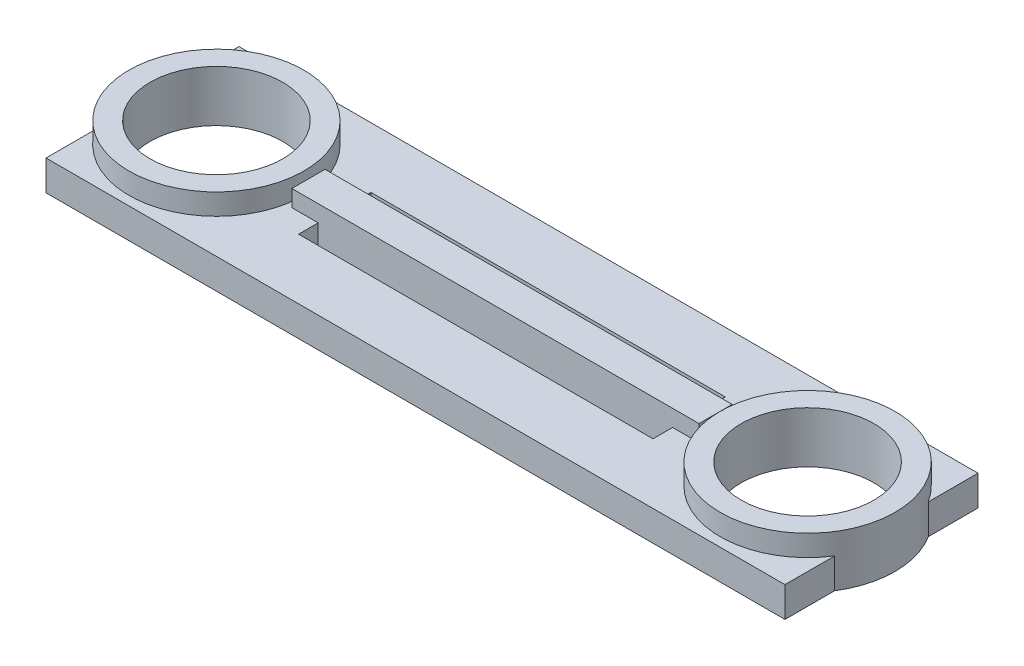
ISO-10303-21;
HEADER;
FILE_DESCRIPTION(('STEP AP214'),'2;1');
FILE_NAME('part.step','',(''),(''),'','','');
FILE_SCHEMA(('AUTOMOTIVE_DESIGN { 1 0 10303 214 1 1 1 1 }'));
ENDSEC;
DATA;
#1=APPLICATION_CONTEXT('core data for automotive mechanical design processes');
#2=APPLICATION_PROTOCOL_DEFINITION('international standard','automotive_design',2000,#1);
#3=PRODUCT_CONTEXT('',#1,'mechanical');
#4=PRODUCT('Part','Part','',(#3));
#5=PRODUCT_RELATED_PRODUCT_CATEGORY('part','',(#4));
#6=PRODUCT_DEFINITION_FORMATION('','',#4);
#7=PRODUCT_DEFINITION_CONTEXT('part definition',#1,'design');
#8=PRODUCT_DEFINITION('design','',#6,#7);
#9=PRODUCT_DEFINITION_SHAPE('','',#8);
#10=(LENGTH_UNIT() NAMED_UNIT(*) SI_UNIT(.MILLI.,.METRE.));
#11=(NAMED_UNIT(*) PLANE_ANGLE_UNIT() SI_UNIT($,.RADIAN.));
#12=(NAMED_UNIT(*) SI_UNIT($,.STERADIAN.) SOLID_ANGLE_UNIT());
#13=UNCERTAINTY_MEASURE_WITH_UNIT(LENGTH_MEASURE(1.E-05),#10,'distance_accuracy_value','');
#14=(GEOMETRIC_REPRESENTATION_CONTEXT(3) GLOBAL_UNCERTAINTY_ASSIGNED_CONTEXT((#13)) GLOBAL_UNIT_ASSIGNED_CONTEXT((#10,
#11,#12)) REPRESENTATION_CONTEXT('',''));
#15=CARTESIAN_POINT('',(0.,0.,0.));
#16=DIRECTION('',(0.,0.,1.));
#17=DIRECTION('',(1.,0.,0.));
#18=AXIS2_PLACEMENT_3D('',#15,#16,#17);
#19=CARTESIAN_POINT('',(0.,20.,0.));
#20=DIRECTION('',(0.,-1.,0.));
#21=DIRECTION('',(0.,0.,-1.));
#22=AXIS2_PLACEMENT_3D('',#19,#20,#21);
#23=PLANE('',#22);
#24=CARTESIAN_POINT('',(196.,20.,0.));
#25=DIRECTION('',(0.,-1.,0.));
#26=DIRECTION('',(0.,0.,-1.));
#27=AXIS2_PLACEMENT_3D('',#24,#25,#26);
#28=CIRCLE('',#27,58.);
#29=CARTESIAN_POINT('',(245.,20.,-31.0322412983658));
#30=VERTEX_POINT('',#29);
#31=CARTESIAN_POINT('',(245.,20.,31.0322412983658));
#32=VERTEX_POINT('',#31);
#33=EDGE_CURVE('E229',#30,#32,#28,.F.);
#34=ORIENTED_EDGE('',*,*,#33,.F.);
#35=DIRECTION('',(0.,0.,-1.));
#36=VECTOR('',#35,1.);
#37=CARTESIAN_POINT('',(245.,20.,64.));
#38=LINE('',#37,#36);
#39=CARTESIAN_POINT('',(245.,20.,-64.));
#40=VERTEX_POINT('',#39);
#41=EDGE_CURVE('E290',#30,#40,#38,.T.);
#42=ORIENTED_EDGE('',*,*,#41,.T.);
#43=DIRECTION('',(-1.,0.,0.));
#44=VECTOR('',#43,1.);
#45=CARTESIAN_POINT('',(-245.,20.,-64.));
#46=LINE('',#45,#44);
#47=CARTESIAN_POINT('',(-245.,20.,-64.));
#48=VERTEX_POINT('',#47);
#49=EDGE_CURVE('E289',#40,#48,#46,.T.);
#50=ORIENTED_EDGE('',*,*,#49,.T.);
#51=DIRECTION('',(0.,0.,1.));
#52=VECTOR('',#51,1.);
#53=CARTESIAN_POINT('',(-245.,20.,64.));
#54=LINE('',#53,#52);
#55=CARTESIAN_POINT('',(-245.,20.,-31.0322412983658));
#56=VERTEX_POINT('',#55);
#57=EDGE_CURVE('E293',#48,#56,#54,.T.);
#58=ORIENTED_EDGE('',*,*,#57,.T.);
#59=CARTESIAN_POINT('',(-196.,20.,0.));
#60=DIRECTION('',(0.,-1.,0.));
#61=DIRECTION('',(0.,0.,-1.));
#62=AXIS2_PLACEMENT_3D('',#59,#60,#61);
#63=CIRCLE('',#62,58.);
#64=CARTESIAN_POINT('',(-245.,20.,31.0322412983658));
#65=VERTEX_POINT('',#64);
#66=EDGE_CURVE('E239',#65,#56,#63,.F.);
#67=ORIENTED_EDGE('',*,*,#66,.F.);
#68=CARTESIAN_POINT('',(-245.,20.,64.));
#69=VERTEX_POINT('',#68);
#70=EDGE_CURVE('E292',#65,#69,#54,.T.);
#71=ORIENTED_EDGE('',*,*,#70,.T.);
#72=DIRECTION('',(1.,0.,0.));
#73=VECTOR('',#72,1.);
#74=CARTESIAN_POINT('',(-245.,20.,64.));
#75=LINE('',#74,#73);
#76=CARTESIAN_POINT('',(245.,20.,64.));
#77=VERTEX_POINT('',#76);
#78=EDGE_CURVE('E296',#69,#77,#75,.T.);
#79=ORIENTED_EDGE('',*,*,#78,.T.);
#80=EDGE_CURVE('E286',#77,#32,#38,.T.);
#81=ORIENTED_EDGE('',*,*,#80,.T.);
#82=EDGE_LOOP('',(#34,#42,#50,#58,#67,#71,#79,#81));
#83=FACE_BOUND('',#82,.T.);
#84=DIRECTION('',(-1.,0.,0.));
#85=VECTOR('',#84,1.);
#86=CARTESIAN_POINT('',(0.,20.,-11.));
#87=LINE('',#86,#85);
#88=CARTESIAN_POINT('',(-117.5,20.,-11.));
#89=VERTEX_POINT('',#88);
#90=CARTESIAN_POINT('',(-135.,20.,-11.));
#91=VERTEX_POINT('',#90);
#92=EDGE_CURVE('E211',#89,#91,#87,.T.);
#93=ORIENTED_EDGE('',*,*,#92,.F.);
#94=DIRECTION('',(0.,0.,1.));
#95=VECTOR('',#94,1.);
#96=CARTESIAN_POINT('',(-117.5,20.,24.));
#97=LINE('',#96,#95);
#98=CARTESIAN_POINT('',(-117.5,20.,-24.));
#99=VERTEX_POINT('',#98);
#100=EDGE_CURVE('E252',#99,#89,#97,.T.);
#101=ORIENTED_EDGE('',*,*,#100,.F.);
#102=DIRECTION('',(-1.,0.,0.));
#103=VECTOR('',#102,1.);
#104=CARTESIAN_POINT('',(-117.5,20.,-24.));
#105=LINE('',#104,#103);
#106=CARTESIAN_POINT('',(117.5,20.,-24.));
#107=VERTEX_POINT('',#106);
#108=EDGE_CURVE('E248',#107,#99,#105,.T.);
#109=ORIENTED_EDGE('',*,*,#108,.F.);
#110=DIRECTION('',(0.,0.,-1.));
#111=VECTOR('',#110,1.);
#112=CARTESIAN_POINT('',(117.5,20.,24.));
#113=LINE('',#112,#111);
#114=CARTESIAN_POINT('',(117.5,20.,-11.));
#115=VERTEX_POINT('',#114);
#116=EDGE_CURVE('E249',#115,#107,#113,.T.);
#117=ORIENTED_EDGE('',*,*,#116,.F.);
#118=CARTESIAN_POINT('',(135.,20.,-11.));
#119=VERTEX_POINT('',#118);
#120=EDGE_CURVE('E214',#119,#115,#87,.T.);
#121=ORIENTED_EDGE('',*,*,#120,.F.);
#122=DIRECTION('',(0.,0.,-1.));
#123=VECTOR('',#122,1.);
#124=CARTESIAN_POINT('',(135.,20.,0.));
#125=LINE('',#124,#123);
#126=CARTESIAN_POINT('',(135.,20.,11.));
#127=VERTEX_POINT('',#126);
#128=EDGE_CURVE('E199',#127,#119,#125,.T.);
#129=ORIENTED_EDGE('',*,*,#128,.F.);
#130=DIRECTION('',(1.,0.,0.));
#131=VECTOR('',#130,1.);
#132=CARTESIAN_POINT('',(0.,20.,11.));
#133=LINE('',#132,#131);
#134=CARTESIAN_POINT('',(117.5,20.,11.));
#135=VERTEX_POINT('',#134);
#136=EDGE_CURVE('E204',#135,#127,#133,.T.);
#137=ORIENTED_EDGE('',*,*,#136,.F.);
#138=CARTESIAN_POINT('',(117.5,20.,24.));
#139=VERTEX_POINT('',#138);
#140=EDGE_CURVE('E245',#139,#135,#113,.T.);
#141=ORIENTED_EDGE('',*,*,#140,.F.);
#142=DIRECTION('',(1.,0.,0.));
#143=VECTOR('',#142,1.);
#144=CARTESIAN_POINT('',(-117.5,20.,24.));
#145=LINE('',#144,#143);
#146=CARTESIAN_POINT('',(-117.5,20.,24.));
#147=VERTEX_POINT('',#146);
#148=EDGE_CURVE('E255',#147,#139,#145,.T.);
#149=ORIENTED_EDGE('',*,*,#148,.F.);
#150=CARTESIAN_POINT('',(-117.5,20.,11.));
#151=VERTEX_POINT('',#150);
#152=EDGE_CURVE('E251',#151,#147,#97,.T.);
#153=ORIENTED_EDGE('',*,*,#152,.F.);
#154=CARTESIAN_POINT('',(-135.,20.,11.));
#155=VERTEX_POINT('',#154);
#156=EDGE_CURVE('E200',#155,#151,#133,.T.);
#157=ORIENTED_EDGE('',*,*,#156,.F.);
#158=DIRECTION('',(0.,0.,1.));
#159=VECTOR('',#158,1.);
#160=CARTESIAN_POINT('',(-135.,20.,0.));
#161=LINE('',#160,#159);
#162=EDGE_CURVE('E217',#91,#155,#161,.T.);
#163=ORIENTED_EDGE('',*,*,#162,.F.);
#164=EDGE_LOOP('',(#93,#101,#109,#117,#121,#129,#137,#141,#149,#153,#157,#163));
#165=FACE_BOUND('',#164,.T.);
#166=ADVANCED_FACE('F39',(#83,#165),#23,.F.);
#167=CARTESIAN_POINT('',(117.5,20.,24.));
#168=DIRECTION('',(-1.,0.,0.));
#169=DIRECTION('',(0.,0.,1.));
#170=AXIS2_PLACEMENT_3D('',#167,#168,#169);
#171=PLANE('',#170);
#172=DIRECTION('',(0.,0.,-1.));
#173=VECTOR('',#172,1.);
#174=CARTESIAN_POINT('',(117.5,0.,24.));
#175=LINE('',#174,#173);
#176=CARTESIAN_POINT('',(117.5,0.,-11.));
#177=VERTEX_POINT('',#176);
#178=CARTESIAN_POINT('',(117.5,0.,-24.));
#179=VERTEX_POINT('',#178);
#180=EDGE_CURVE('E244',#177,#179,#175,.T.);
#181=ORIENTED_EDGE('',*,*,#180,.F.);
#182=DIRECTION('',(0.,1.,0.));
#183=VECTOR('',#182,1.);
#184=CARTESIAN_POINT('',(117.5,20.,-11.));
#185=LINE('',#184,#183);
#186=EDGE_CURVE('E213',#177,#115,#185,.T.);
#187=ORIENTED_EDGE('',*,*,#186,.T.);
#188=ORIENTED_EDGE('',*,*,#116,.T.);
#189=DIRECTION('',(0.,-1.,0.));
#190=VECTOR('',#189,1.);
#191=CARTESIAN_POINT('',(117.5,20.,-24.));
#192=LINE('',#191,#190);
#193=EDGE_CURVE('E276',#107,#179,#192,.T.);
#194=ORIENTED_EDGE('',*,*,#193,.T.);
#195=EDGE_LOOP('',(#181,#187,#188,#194));
#196=FACE_BOUND('',#195,.T.);
#197=ADVANCED_FACE('F389',(#196),#171,.T.);
#198=ORIENTED_EDGE('',*,*,#140,.T.);
#199=DIRECTION('',(0.,-1.,0.));
#200=VECTOR('',#199,1.);
#201=CARTESIAN_POINT('',(117.5,20.,11.));
#202=LINE('',#201,#200);
#203=CARTESIAN_POINT('',(117.5,0.,11.));
#204=VERTEX_POINT('',#203);
#205=EDGE_CURVE('E202',#135,#204,#202,.T.);
#206=ORIENTED_EDGE('',*,*,#205,.T.);
#207=CARTESIAN_POINT('',(117.5,0.,24.));
#208=VERTEX_POINT('',#207);
#209=EDGE_CURVE('E258',#208,#204,#175,.T.);
#210=ORIENTED_EDGE('',*,*,#209,.F.);
#211=DIRECTION('',(0.,-1.,0.));
#212=VECTOR('',#211,1.);
#213=CARTESIAN_POINT('',(117.5,20.,24.));
#214=LINE('',#213,#212);
#215=EDGE_CURVE('E257',#139,#208,#214,.T.);
#216=ORIENTED_EDGE('',*,*,#215,.F.);
#217=EDGE_LOOP('',(#198,#206,#210,#216));
#218=FACE_BOUND('',#217,.T.);
#219=ADVANCED_FACE('F349',(#218),#171,.T.);
#220=CARTESIAN_POINT('',(-117.5,20.,24.));
#221=DIRECTION('',(1.,0.,0.));
#222=DIRECTION('',(0.,0.,-1.));
#223=AXIS2_PLACEMENT_3D('',#220,#221,#222);
#224=PLANE('',#223);
#225=ORIENTED_EDGE('',*,*,#100,.T.);
#226=DIRECTION('',(0.,-1.,0.));
#227=VECTOR('',#226,1.);
#228=CARTESIAN_POINT('',(-117.5,20.,-11.));
#229=LINE('',#228,#227);
#230=CARTESIAN_POINT('',(-117.5,0.,-11.));
#231=VERTEX_POINT('',#230);
#232=EDGE_CURVE('E11',#89,#231,#229,.T.);
#233=ORIENTED_EDGE('',*,*,#232,.T.);
#234=DIRECTION('',(0.,0.,1.));
#235=VECTOR('',#234,1.);
#236=CARTESIAN_POINT('',(-117.5,0.,24.));
#237=LINE('',#236,#235);
#238=CARTESIAN_POINT('',(-117.5,0.,-24.));
#239=VERTEX_POINT('',#238);
#240=EDGE_CURVE('E264',#239,#231,#237,.T.);
#241=ORIENTED_EDGE('',*,*,#240,.F.);
#242=DIRECTION('',(0.,-1.,0.));
#243=VECTOR('',#242,1.);
#244=CARTESIAN_POINT('',(-117.5,20.,-24.));
#245=LINE('',#244,#243);
#246=EDGE_CURVE('E274',#99,#239,#245,.T.);
#247=ORIENTED_EDGE('',*,*,#246,.F.);
#248=EDGE_LOOP('',(#225,#233,#241,#247));
#249=FACE_BOUND('',#248,.T.);
#250=ADVANCED_FACE('F437',(#249),#224,.T.);
#251=CARTESIAN_POINT('',(-117.5,0.,11.));
#252=VERTEX_POINT('',#251);
#253=CARTESIAN_POINT('',(-117.5,0.,24.));
#254=VERTEX_POINT('',#253);
#255=EDGE_CURVE('E263',#252,#254,#237,.T.);
#256=ORIENTED_EDGE('',*,*,#255,.F.);
#257=DIRECTION('',(0.,1.,0.));
#258=VECTOR('',#257,1.);
#259=CARTESIAN_POINT('',(-117.5,20.,11.));
#260=LINE('',#259,#258);
#261=EDGE_CURVE('E47',#252,#151,#260,.T.);
#262=ORIENTED_EDGE('',*,*,#261,.T.);
#263=ORIENTED_EDGE('',*,*,#152,.T.);
#264=DIRECTION('',(0.,-1.,0.));
#265=VECTOR('',#264,1.);
#266=CARTESIAN_POINT('',(-117.5,20.,24.));
#267=LINE('',#266,#265);
#268=EDGE_CURVE('E271',#147,#254,#267,.T.);
#269=ORIENTED_EDGE('',*,*,#268,.T.);
#270=EDGE_LOOP('',(#256,#262,#263,#269));
#271=FACE_BOUND('',#270,.T.);
#272=ADVANCED_FACE('F334',(#271),#224,.T.);
#273=CARTESIAN_POINT('',(245.,20.,64.));
#274=DIRECTION('',(-1.,0.,0.));
#275=DIRECTION('',(0.,0.,1.));
#276=AXIS2_PLACEMENT_3D('',#273,#274,#275);
#277=PLANE('',#276);
#278=DIRECTION('',(0.,-1.,0.));
#279=VECTOR('',#278,1.);
#280=CARTESIAN_POINT('',(245.,34.,-31.0322412983658));
#281=LINE('',#280,#279);
#282=CARTESIAN_POINT('',(245.,0.,-31.0322412983658));
#283=VERTEX_POINT('',#282);
#284=EDGE_CURVE('E328',#283,#30,#281,.F.);
#285=ORIENTED_EDGE('',*,*,#284,.F.);
#286=DIRECTION('',(0.,0.,-1.));
#287=VECTOR('',#286,1.);
#288=CARTESIAN_POINT('',(245.,0.,64.));
#289=LINE('',#288,#287);
#290=CARTESIAN_POINT('',(245.,0.,-64.));
#291=VERTEX_POINT('',#290);
#292=EDGE_CURVE('E285',#283,#291,#289,.T.);
#293=ORIENTED_EDGE('',*,*,#292,.T.);
#294=DIRECTION('',(0.,-1.,0.));
#295=VECTOR('',#294,1.);
#296=CARTESIAN_POINT('',(245.,20.,-64.));
#297=LINE('',#296,#295);
#298=EDGE_CURVE('E316',#40,#291,#297,.T.);
#299=ORIENTED_EDGE('',*,*,#298,.F.);
#300=ORIENTED_EDGE('',*,*,#41,.F.);
#301=EDGE_LOOP('',(#285,#293,#299,#300));
#302=FACE_BOUND('',#301,.T.);
#303=ADVANCED_FACE('F41',(#302),#277,.F.);
#304=DIRECTION('',(0.,-1.,0.));
#305=VECTOR('',#304,1.);
#306=CARTESIAN_POINT('',(245.,34.,31.0322412983658));
#307=LINE('',#306,#305);
#308=CARTESIAN_POINT('',(245.,0.,31.0322412983658));
#309=VERTEX_POINT('',#308);
#310=EDGE_CURVE('E325',#32,#309,#307,.T.);
#311=ORIENTED_EDGE('',*,*,#310,.F.);
#312=ORIENTED_EDGE('',*,*,#80,.F.);
#313=DIRECTION('',(0.,-1.,0.));
#314=VECTOR('',#313,1.);
#315=CARTESIAN_POINT('',(245.,20.,64.));
#316=LINE('',#315,#314);
#317=CARTESIAN_POINT('',(245.,0.,64.));
#318=VERTEX_POINT('',#317);
#319=EDGE_CURVE('E298',#77,#318,#316,.T.);
#320=ORIENTED_EDGE('',*,*,#319,.T.);
#321=EDGE_CURVE('E299',#318,#309,#289,.T.);
#322=ORIENTED_EDGE('',*,*,#321,.T.);
#323=EDGE_LOOP('',(#311,#312,#320,#322));
#324=FACE_BOUND('',#323,.T.);
#325=ADVANCED_FACE('F404',(#324),#277,.F.);
#326=CARTESIAN_POINT('',(-245.,20.,64.));
#327=DIRECTION('',(1.,0.,0.));
#328=DIRECTION('',(0.,0.,-1.));
#329=AXIS2_PLACEMENT_3D('',#326,#327,#328);
#330=PLANE('',#329);
#331=DIRECTION('',(0.,-1.,0.));
#332=VECTOR('',#331,1.);
#333=CARTESIAN_POINT('',(-245.,34.,31.0322412983658));
#334=LINE('',#333,#332);
#335=CARTESIAN_POINT('',(-245.,0.,31.0322412983658));
#336=VERTEX_POINT('',#335);
#337=EDGE_CURVE('E322',#336,#65,#334,.F.);
#338=ORIENTED_EDGE('',*,*,#337,.F.);
#339=DIRECTION('',(0.,0.,1.));
#340=VECTOR('',#339,1.);
#341=CARTESIAN_POINT('',(-245.,0.,64.));
#342=LINE('',#341,#340);
#343=CARTESIAN_POINT('',(-245.,0.,64.));
#344=VERTEX_POINT('',#343);
#345=EDGE_CURVE('E303',#336,#344,#342,.T.);
#346=ORIENTED_EDGE('',*,*,#345,.T.);
#347=DIRECTION('',(0.,-1.,0.));
#348=VECTOR('',#347,1.);
#349=CARTESIAN_POINT('',(-245.,20.,64.));
#350=LINE('',#349,#348);
#351=EDGE_CURVE('E310',#69,#344,#350,.T.);
#352=ORIENTED_EDGE('',*,*,#351,.F.);
#353=ORIENTED_EDGE('',*,*,#70,.F.);
#354=EDGE_LOOP('',(#338,#346,#352,#353));
#355=FACE_BOUND('',#354,.T.);
#356=ADVANCED_FACE('F402',(#355),#330,.F.);
#357=DIRECTION('',(0.,-1.,0.));
#358=VECTOR('',#357,1.);
#359=CARTESIAN_POINT('',(-245.,34.,-31.0322412983658));
#360=LINE('',#359,#358);
#361=CARTESIAN_POINT('',(-245.,0.,-31.0322412983658));
#362=VERTEX_POINT('',#361);
#363=EDGE_CURVE('E319',#56,#362,#360,.T.);
#364=ORIENTED_EDGE('',*,*,#363,.F.);
#365=ORIENTED_EDGE('',*,*,#57,.F.);
#366=DIRECTION('',(0.,-1.,0.));
#367=VECTOR('',#366,1.);
#368=CARTESIAN_POINT('',(-245.,20.,-64.));
#369=LINE('',#368,#367);
#370=CARTESIAN_POINT('',(-245.,0.,-64.));
#371=VERTEX_POINT('',#370);
#372=EDGE_CURVE('E313',#48,#371,#369,.T.);
#373=ORIENTED_EDGE('',*,*,#372,.T.);
#374=EDGE_CURVE('E304',#371,#362,#342,.T.);
#375=ORIENTED_EDGE('',*,*,#374,.T.);
#376=EDGE_LOOP('',(#364,#365,#373,#375));
#377=FACE_BOUND('',#376,.T.);
#378=ADVANCED_FACE('F354',(#377),#330,.F.);
#379=CARTESIAN_POINT('',(0.,0.,0.));
#380=DIRECTION('',(0.,-1.,0.));
#381=DIRECTION('',(0.,0.,-1.));
#382=AXIS2_PLACEMENT_3D('',#379,#380,#381);
#383=PLANE('',#382);
#384=DIRECTION('',(-1.,0.,0.));
#385=VECTOR('',#384,1.);
#386=CARTESIAN_POINT('',(-135.,0.,-11.));
#387=LINE('',#386,#385);
#388=EDGE_CURVE('E54',#177,#231,#387,.T.);
#389=ORIENTED_EDGE('',*,*,#388,.F.);
#390=ORIENTED_EDGE('',*,*,#180,.T.);
#391=DIRECTION('',(-1.,0.,0.));
#392=VECTOR('',#391,1.);
#393=CARTESIAN_POINT('',(-117.5,0.,-24.));
#394=LINE('',#393,#392);
#395=EDGE_CURVE('E260',#179,#239,#394,.T.);
#396=ORIENTED_EDGE('',*,*,#395,.T.);
#397=ORIENTED_EDGE('',*,*,#240,.T.);
#398=EDGE_LOOP('',(#389,#390,#396,#397));
#399=FACE_BOUND('',#398,.T.);
#400=DIRECTION('',(1.,0.,0.));
#401=VECTOR('',#400,1.);
#402=CARTESIAN_POINT('',(-135.,0.,11.));
#403=LINE('',#402,#401);
#404=EDGE_CURVE('E62',#252,#204,#403,.T.);
#405=ORIENTED_EDGE('',*,*,#404,.F.);
#406=ORIENTED_EDGE('',*,*,#255,.T.);
#407=DIRECTION('',(1.,0.,0.));
#408=VECTOR('',#407,1.);
#409=CARTESIAN_POINT('',(-117.5,0.,24.));
#410=LINE('',#409,#408);
#411=EDGE_CURVE('E266',#254,#208,#410,.T.);
#412=ORIENTED_EDGE('',*,*,#411,.T.);
#413=ORIENTED_EDGE('',*,*,#209,.T.);
#414=EDGE_LOOP('',(#405,#406,#412,#413));
#415=FACE_BOUND('',#414,.T.);
#416=CARTESIAN_POINT('',(196.,0.,0.));
#417=DIRECTION('',(0.,1.,0.));
#418=DIRECTION('',(0.,0.,1.));
#419=AXIS2_PLACEMENT_3D('',#416,#417,#418);
#420=CIRCLE('',#419,58.);
#421=EDGE_CURVE('E221',#309,#283,#420,.T.);
#422=ORIENTED_EDGE('',*,*,#421,.F.);
#423=ORIENTED_EDGE('',*,*,#321,.F.);
#424=DIRECTION('',(1.,0.,0.));
#425=VECTOR('',#424,1.);
#426=CARTESIAN_POINT('',(-245.,0.,64.));
#427=LINE('',#426,#425);
#428=EDGE_CURVE('E306',#344,#318,#427,.T.);
#429=ORIENTED_EDGE('',*,*,#428,.F.);
#430=ORIENTED_EDGE('',*,*,#345,.F.);
#431=CARTESIAN_POINT('',(-196.,0.,0.));
#432=DIRECTION('',(0.,1.,0.));
#433=DIRECTION('',(0.,0.,1.));
#434=AXIS2_PLACEMENT_3D('',#431,#432,#433);
#435=CIRCLE('',#434,58.);
#436=EDGE_CURVE('E235',#362,#336,#435,.T.);
#437=ORIENTED_EDGE('',*,*,#436,.F.);
#438=ORIENTED_EDGE('',*,*,#374,.F.);
#439=DIRECTION('',(-1.,0.,0.));
#440=VECTOR('',#439,1.);
#441=CARTESIAN_POINT('',(-245.,0.,-64.));
#442=LINE('',#441,#440);
#443=EDGE_CURVE('E301',#291,#371,#442,.T.);
#444=ORIENTED_EDGE('',*,*,#443,.F.);
#445=ORIENTED_EDGE('',*,*,#292,.F.);
#446=EDGE_LOOP('',(#422,#423,#429,#430,#437,#438,#444,#445));
#447=FACE_BOUND('',#446,.T.);
#448=CARTESIAN_POINT('',(196.,0.,0.));
#449=DIRECTION('',(0.,1.,0.));
#450=DIRECTION('',(0.,0.,1.));
#451=AXIS2_PLACEMENT_3D('',#448,#449,#450);
#452=CIRCLE('',#451,44.);
#453=CARTESIAN_POINT('',(196.,0.,44.));
#454=VERTEX_POINT('',#453);
#455=EDGE_CURVE('E279',#454,#454,#452,.T.);
#456=ORIENTED_EDGE('',*,*,#455,.T.);
#457=EDGE_LOOP('',(#456));
#458=FACE_BOUND('',#457,.T.);
#459=CARTESIAN_POINT('',(-196.,0.,0.));
#460=DIRECTION('',(0.,1.,0.));
#461=DIRECTION('',(0.,0.,1.));
#462=AXIS2_PLACEMENT_3D('',#459,#460,#461);
#463=CIRCLE('',#462,44.);
#464=CARTESIAN_POINT('',(-196.,0.,44.));
#465=VERTEX_POINT('',#464);
#466=EDGE_CURVE('E282',#465,#465,#463,.T.);
#467=ORIENTED_EDGE('',*,*,#466,.T.);
#468=EDGE_LOOP('',(#467));
#469=FACE_BOUND('',#468,.T.);
#470=ADVANCED_FACE('F350',(#399,#415,#447,#458,#469),#383,.T.);
#471=CARTESIAN_POINT('',(-245.,20.,-64.));
#472=DIRECTION('',(0.,0.,1.));
#473=DIRECTION('',(1.,0.,0.));
#474=AXIS2_PLACEMENT_3D('',#471,#472,#473);
#475=PLANE('',#474);
#476=ORIENTED_EDGE('',*,*,#443,.T.);
#477=ORIENTED_EDGE('',*,*,#372,.F.);
#478=ORIENTED_EDGE('',*,*,#49,.F.);
#479=ORIENTED_EDGE('',*,*,#298,.T.);
#480=EDGE_LOOP('',(#476,#477,#478,#479));
#481=FACE_BOUND('',#480,.T.);
#482=ADVANCED_FACE('F353',(#481),#475,.F.);
#483=CARTESIAN_POINT('',(-245.,20.,64.));
#484=DIRECTION('',(0.,0.,-1.));
#485=DIRECTION('',(-1.,0.,0.));
#486=AXIS2_PLACEMENT_3D('',#483,#484,#485);
#487=PLANE('',#486);
#488=ORIENTED_EDGE('',*,*,#428,.T.);
#489=ORIENTED_EDGE('',*,*,#319,.F.);
#490=ORIENTED_EDGE('',*,*,#78,.F.);
#491=ORIENTED_EDGE('',*,*,#351,.T.);
#492=EDGE_LOOP('',(#488,#489,#490,#491));
#493=FACE_BOUND('',#492,.T.);
#494=ADVANCED_FACE('F368',(#493),#487,.F.);
#495=CARTESIAN_POINT('',(-196.,20.,0.));
#496=DIRECTION('',(0.,-1.,0.));
#497=DIRECTION('',(0.,0.,-1.));
#498=AXIS2_PLACEMENT_3D('',#495,#496,#497);
#499=CYLINDRICAL_SURFACE('',#498,44.);
#500=ORIENTED_EDGE('',*,*,#466,.F.);
#501=EDGE_LOOP('',(#500));
#502=FACE_BOUND('',#501,.T.);
#503=CARTESIAN_POINT('',(-196.,34.,0.));
#504=DIRECTION('',(0.,1.,0.));
#505=DIRECTION('',(0.,0.,1.));
#506=AXIS2_PLACEMENT_3D('',#503,#504,#505);
#507=CIRCLE('',#506,44.);
#508=CARTESIAN_POINT('',(-196.,34.,44.));
#509=VERTEX_POINT('',#508);
#510=EDGE_CURVE('E232',#509,#509,#507,.T.);
#511=ORIENTED_EDGE('',*,*,#510,.T.);
#512=EDGE_LOOP('',(#511));
#513=FACE_BOUND('',#512,.T.);
#514=ADVANCED_FACE('F364',(#502,#513),#499,.F.);
#515=CARTESIAN_POINT('',(196.,20.,0.));
#516=DIRECTION('',(0.,-1.,0.));
#517=DIRECTION('',(0.,0.,-1.));
#518=AXIS2_PLACEMENT_3D('',#515,#516,#517);
#519=CYLINDRICAL_SURFACE('',#518,44.);
#520=ORIENTED_EDGE('',*,*,#455,.F.);
#521=EDGE_LOOP('',(#520));
#522=FACE_BOUND('',#521,.T.);
#523=CARTESIAN_POINT('',(196.,34.,0.));
#524=DIRECTION('',(0.,1.,0.));
#525=DIRECTION('',(0.,0.,1.));
#526=AXIS2_PLACEMENT_3D('',#523,#524,#525);
#527=CIRCLE('',#526,44.);
#528=CARTESIAN_POINT('',(196.,34.,44.));
#529=VERTEX_POINT('',#528);
#530=EDGE_CURVE('E224',#529,#529,#527,.T.);
#531=ORIENTED_EDGE('',*,*,#530,.T.);
#532=EDGE_LOOP('',(#531));
#533=FACE_BOUND('',#532,.T.);
#534=ADVANCED_FACE('F367',(#522,#533),#519,.F.);
#535=CARTESIAN_POINT('',(-117.5,20.,-24.));
#536=DIRECTION('',(0.,0.,1.));
#537=DIRECTION('',(1.,0.,0.));
#538=AXIS2_PLACEMENT_3D('',#535,#536,#537);
#539=PLANE('',#538);
#540=ORIENTED_EDGE('',*,*,#395,.F.);
#541=ORIENTED_EDGE('',*,*,#193,.F.);
#542=ORIENTED_EDGE('',*,*,#108,.T.);
#543=ORIENTED_EDGE('',*,*,#246,.T.);
#544=EDGE_LOOP('',(#540,#541,#542,#543));
#545=FACE_BOUND('',#544,.T.);
#546=ADVANCED_FACE('F445',(#545),#539,.T.);
#547=CARTESIAN_POINT('',(-117.5,20.,24.));
#548=DIRECTION('',(0.,0.,-1.));
#549=DIRECTION('',(-1.,0.,0.));
#550=AXIS2_PLACEMENT_3D('',#547,#548,#549);
#551=PLANE('',#550);
#552=ORIENTED_EDGE('',*,*,#411,.F.);
#553=ORIENTED_EDGE('',*,*,#268,.F.);
#554=ORIENTED_EDGE('',*,*,#148,.T.);
#555=ORIENTED_EDGE('',*,*,#215,.T.);
#556=EDGE_LOOP('',(#552,#553,#554,#555));
#557=FACE_BOUND('',#556,.T.);
#558=ADVANCED_FACE('F347',(#557),#551,.T.);
#559=CARTESIAN_POINT('',(-196.,34.,0.));
#560=DIRECTION('',(0.,-1.,0.));
#561=DIRECTION('',(0.,0.,-1.));
#562=AXIS2_PLACEMENT_3D('',#559,#560,#561);
#563=CYLINDRICAL_SURFACE('',#562,58.);
#564=CARTESIAN_POINT('',(-196.,34.,0.));
#565=DIRECTION('',(0.,1.,0.));
#566=DIRECTION('',(0.,0.,1.));
#567=AXIS2_PLACEMENT_3D('',#564,#565,#566);
#568=CIRCLE('',#567,58.);
#569=CARTESIAN_POINT('',(-196.,34.,58.));
#570=VERTEX_POINT('',#569);
#571=EDGE_CURVE('E236',#570,#570,#568,.T.);
#572=ORIENTED_EDGE('',*,*,#571,.F.);
#573=EDGE_LOOP('',(#572));
#574=FACE_BOUND('',#573,.T.);
#575=ORIENTED_EDGE('',*,*,#436,.T.);
#576=ORIENTED_EDGE('',*,*,#337,.T.);
#577=ORIENTED_EDGE('',*,*,#66,.T.);
#578=ORIENTED_EDGE('',*,*,#363,.T.);
#579=EDGE_LOOP('',(#575,#576,#577,#578));
#580=FACE_BOUND('',#579,.T.);
#581=ADVANCED_FACE('F375',(#574,#580),#563,.T.);
#582=CARTESIAN_POINT('',(-196.,34.,0.));
#583=DIRECTION('',(0.,1.,0.));
#584=DIRECTION('',(0.,0.,1.));
#585=AXIS2_PLACEMENT_3D('',#582,#583,#584);
#586=PLANE('',#585);
#587=ORIENTED_EDGE('',*,*,#571,.T.);
#588=EDGE_LOOP('',(#587));
#589=FACE_BOUND('',#588,.T.);
#590=ORIENTED_EDGE('',*,*,#510,.F.);
#591=EDGE_LOOP('',(#590));
#592=FACE_BOUND('',#591,.T.);
#593=ADVANCED_FACE('F372',(#589,#592),#586,.T.);
#594=CARTESIAN_POINT('',(196.,34.,0.));
#595=DIRECTION('',(0.,-1.,0.));
#596=DIRECTION('',(0.,0.,-1.));
#597=AXIS2_PLACEMENT_3D('',#594,#595,#596);
#598=CYLINDRICAL_SURFACE('',#597,58.);
#599=CARTESIAN_POINT('',(196.,34.,0.));
#600=DIRECTION('',(0.,1.,0.));
#601=DIRECTION('',(0.,0.,1.));
#602=AXIS2_PLACEMENT_3D('',#599,#600,#601);
#603=CIRCLE('',#602,58.);
#604=CARTESIAN_POINT('',(196.,34.,58.));
#605=VERTEX_POINT('',#604);
#606=EDGE_CURVE('E220',#605,#605,#603,.T.);
#607=ORIENTED_EDGE('',*,*,#606,.F.);
#608=EDGE_LOOP('',(#607));
#609=FACE_BOUND('',#608,.T.);
#610=ORIENTED_EDGE('',*,*,#421,.T.);
#611=ORIENTED_EDGE('',*,*,#284,.T.);
#612=ORIENTED_EDGE('',*,*,#33,.T.);
#613=ORIENTED_EDGE('',*,*,#310,.T.);
#614=EDGE_LOOP('',(#610,#611,#612,#613));
#615=FACE_BOUND('',#614,.T.);
#616=ADVANCED_FACE('F374',(#609,#615),#598,.T.);
#617=CARTESIAN_POINT('',(196.,34.,0.));
#618=DIRECTION('',(0.,1.,0.));
#619=DIRECTION('',(0.,0.,1.));
#620=AXIS2_PLACEMENT_3D('',#617,#618,#619);
#621=PLANE('',#620);
#622=ORIENTED_EDGE('',*,*,#606,.T.);
#623=EDGE_LOOP('',(#622));
#624=FACE_BOUND('',#623,.T.);
#625=ORIENTED_EDGE('',*,*,#530,.F.);
#626=EDGE_LOOP('',(#625));
#627=FACE_BOUND('',#626,.T.);
#628=ADVANCED_FACE('F382',(#624,#627),#621,.T.);
#629=CARTESIAN_POINT('',(135.,31.,11.));
#630=DIRECTION('',(-1.,0.,0.));
#631=DIRECTION('',(0.,0.,1.));
#632=AXIS2_PLACEMENT_3D('',#629,#630,#631);
#633=PLANE('',#632);
#634=DIRECTION('',(0.,-1.,0.));
#635=VECTOR('',#634,1.);
#636=CARTESIAN_POINT('',(135.,31.,11.));
#637=LINE('',#636,#635);
#638=CARTESIAN_POINT('',(135.,31.,11.));
#639=VERTEX_POINT('',#638);
#640=EDGE_CURVE('E684',#639,#127,#637,.T.);
#641=ORIENTED_EDGE('',*,*,#640,.T.);
#642=ORIENTED_EDGE('',*,*,#128,.T.);
#643=DIRECTION('',(0.,-1.,0.));
#644=VECTOR('',#643,1.);
#645=CARTESIAN_POINT('',(135.,31.,-11.));
#646=LINE('',#645,#644);
#647=CARTESIAN_POINT('',(135.,31.,-11.));
#648=VERTEX_POINT('',#647);
#649=EDGE_CURVE('E180',#648,#119,#646,.T.);
#650=ORIENTED_EDGE('',*,*,#649,.F.);
#651=DIRECTION('',(0.,0.,-1.));
#652=VECTOR('',#651,1.);
#653=CARTESIAN_POINT('',(135.,31.,11.));
#654=LINE('',#653,#652);
#655=EDGE_CURVE('E187',#639,#648,#654,.T.);
#656=ORIENTED_EDGE('',*,*,#655,.F.);
#657=EDGE_LOOP('',(#641,#642,#650,#656));
#658=FACE_BOUND('',#657,.T.);
#659=ADVANCED_FACE('F197',(#658),#633,.F.);
#660=CARTESIAN_POINT('',(-135.,31.,11.));
#661=DIRECTION('',(1.,0.,0.));
#662=DIRECTION('',(0.,0.,-1.));
#663=AXIS2_PLACEMENT_3D('',#660,#661,#662);
#664=PLANE('',#663);
#665=DIRECTION('',(0.,-1.,0.));
#666=VECTOR('',#665,1.);
#667=CARTESIAN_POINT('',(-135.,31.,-11.));
#668=LINE('',#667,#666);
#669=CARTESIAN_POINT('',(-135.,31.,-11.));
#670=VERTEX_POINT('',#669);
#671=EDGE_CURVE('E183',#670,#91,#668,.T.);
#672=ORIENTED_EDGE('',*,*,#671,.T.);
#673=ORIENTED_EDGE('',*,*,#162,.T.);
#674=DIRECTION('',(0.,-1.,0.));
#675=VECTOR('',#674,1.);
#676=CARTESIAN_POINT('',(-135.,31.,11.));
#677=LINE('',#676,#675);
#678=CARTESIAN_POINT('',(-135.,31.,11.));
#679=VERTEX_POINT('',#678);
#680=EDGE_CURVE('E205',#679,#155,#677,.T.);
#681=ORIENTED_EDGE('',*,*,#680,.F.);
#682=DIRECTION('',(0.,0.,1.));
#683=VECTOR('',#682,1.);
#684=CARTESIAN_POINT('',(-135.,31.,11.));
#685=LINE('',#684,#683);
#686=EDGE_CURVE('E186',#670,#679,#685,.T.);
#687=ORIENTED_EDGE('',*,*,#686,.F.);
#688=EDGE_LOOP('',(#672,#673,#681,#687));
#689=FACE_BOUND('',#688,.T.);
#690=ADVANCED_FACE('F460',(#689),#664,.F.);
#691=CARTESIAN_POINT('',(-135.,31.,-11.));
#692=DIRECTION('',(0.,0.,1.));
#693=DIRECTION('',(1.,0.,0.));
#694=AXIS2_PLACEMENT_3D('',#691,#692,#693);
#695=PLANE('',#694);
#696=ORIENTED_EDGE('',*,*,#649,.T.);
#697=ORIENTED_EDGE('',*,*,#120,.T.);
#698=ORIENTED_EDGE('',*,*,#186,.F.);
#699=ORIENTED_EDGE('',*,*,#388,.T.);
#700=ORIENTED_EDGE('',*,*,#232,.F.);
#701=ORIENTED_EDGE('',*,*,#92,.T.);
#702=ORIENTED_EDGE('',*,*,#671,.F.);
#703=DIRECTION('',(-1.,0.,0.));
#704=VECTOR('',#703,1.);
#705=CARTESIAN_POINT('',(-135.,31.,-11.));
#706=LINE('',#705,#704);
#707=EDGE_CURVE('E176',#648,#670,#706,.T.);
#708=ORIENTED_EDGE('',*,*,#707,.F.);
#709=EDGE_LOOP('',(#696,#697,#698,#699,#700,#701,#702,#708));
#710=FACE_BOUND('',#709,.T.);
#711=ADVANCED_FACE('F178',(#710),#695,.F.);
#712=CARTESIAN_POINT('',(-135.,31.,11.));
#713=DIRECTION('',(0.,0.,-1.));
#714=DIRECTION('',(-1.,0.,0.));
#715=AXIS2_PLACEMENT_3D('',#712,#713,#714);
#716=PLANE('',#715);
#717=ORIENTED_EDGE('',*,*,#205,.F.);
#718=ORIENTED_EDGE('',*,*,#136,.T.);
#719=ORIENTED_EDGE('',*,*,#640,.F.);
#720=DIRECTION('',(1.,0.,0.));
#721=VECTOR('',#720,1.);
#722=CARTESIAN_POINT('',(-135.,31.,11.));
#723=LINE('',#722,#721);
#724=EDGE_CURVE('E192',#679,#639,#723,.T.);
#725=ORIENTED_EDGE('',*,*,#724,.F.);
#726=ORIENTED_EDGE('',*,*,#680,.T.);
#727=ORIENTED_EDGE('',*,*,#156,.T.);
#728=ORIENTED_EDGE('',*,*,#261,.F.);
#729=ORIENTED_EDGE('',*,*,#404,.T.);
#730=EDGE_LOOP('',(#717,#718,#719,#725,#726,#727,#728,#729));
#731=FACE_BOUND('',#730,.T.);
#732=ADVANCED_FACE('F465',(#731),#716,.F.);
#733=CARTESIAN_POINT('',(0.,31.,0.));
#734=DIRECTION('',(0.,-1.,0.));
#735=DIRECTION('',(0.,0.,-1.));
#736=AXIS2_PLACEMENT_3D('',#733,#734,#735);
#737=PLANE('',#736);
#738=ORIENTED_EDGE('',*,*,#655,.T.);
#739=ORIENTED_EDGE('',*,*,#707,.T.);
#740=ORIENTED_EDGE('',*,*,#686,.T.);
#741=ORIENTED_EDGE('',*,*,#724,.T.);
#742=EDGE_LOOP('',(#738,#739,#740,#741));
#743=FACE_BOUND('',#742,.T.);
#744=ADVANCED_FACE('F190',(#743),#737,.F.);
#745=CLOSED_SHELL('',(#166,#197,#219,#250,#272,#303,#325,#356,#378,#470,#482,#494,#514,#534,
#546,#558,#581,#593,#616,#628,#659,#690,#711,#732,#744));
#746=MANIFOLD_SOLID_BREP('B2',#745);
#747=ADVANCED_BREP_SHAPE_REPRESENTATION('',(#18,#746),#14);
#748=SHAPE_DEFINITION_REPRESENTATION(#9,#747);
ENDSEC;
END-ISO-10303-21;
